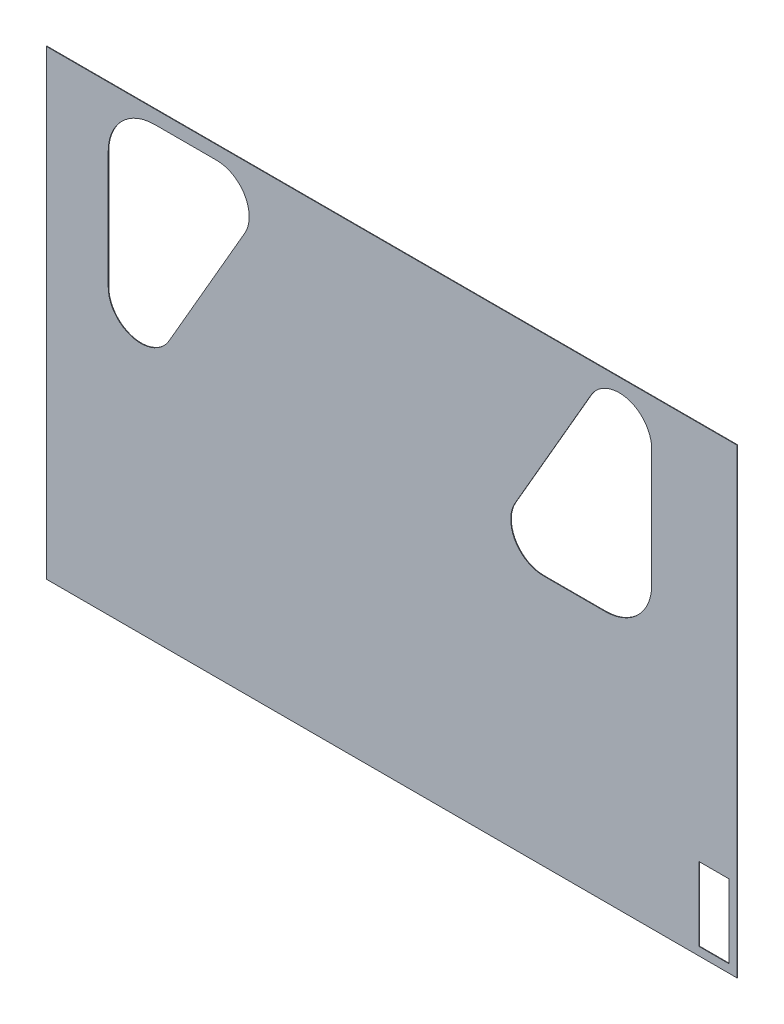
ISO-10303-21;
HEADER;
FILE_DESCRIPTION(('STEP AP214'),'2;1');
FILE_NAME('part.step','',(''),(''),'','','');
FILE_SCHEMA(('AUTOMOTIVE_DESIGN { 1 0 10303 214 1 1 1 1 }'));
ENDSEC;
DATA;
#1=APPLICATION_CONTEXT('core data for automotive mechanical design processes');
#2=APPLICATION_PROTOCOL_DEFINITION('international standard','automotive_design',2000,#1);
#3=PRODUCT_CONTEXT('',#1,'mechanical');
#4=PRODUCT('Part','Part','',(#3));
#5=PRODUCT_RELATED_PRODUCT_CATEGORY('part','',(#4));
#6=PRODUCT_DEFINITION_FORMATION('','',#4);
#7=PRODUCT_DEFINITION_CONTEXT('part definition',#1,'design');
#8=PRODUCT_DEFINITION('design','',#6,#7);
#9=PRODUCT_DEFINITION_SHAPE('','',#8);
#10=(LENGTH_UNIT() NAMED_UNIT(*) SI_UNIT(.MILLI.,.METRE.));
#11=(NAMED_UNIT(*) PLANE_ANGLE_UNIT() SI_UNIT($,.RADIAN.));
#12=(NAMED_UNIT(*) SI_UNIT($,.STERADIAN.) SOLID_ANGLE_UNIT());
#13=UNCERTAINTY_MEASURE_WITH_UNIT(LENGTH_MEASURE(1.E-05),#10,'distance_accuracy_value','');
#14=(GEOMETRIC_REPRESENTATION_CONTEXT(3) GLOBAL_UNCERTAINTY_ASSIGNED_CONTEXT((#13)) GLOBAL_UNIT_ASSIGNED_CONTEXT((#10,
#11,#12)) REPRESENTATION_CONTEXT('',''));
#15=CARTESIAN_POINT('',(0.,0.,0.));
#16=DIRECTION('',(0.,0.,1.));
#17=DIRECTION('',(1.,0.,0.));
#18=AXIS2_PLACEMENT_3D('',#15,#16,#17);
#19=CARTESIAN_POINT('',(0.,0.,2.));
#20=DIRECTION('',(0.,0.,-1.));
#21=DIRECTION('',(-1.,0.,0.));
#22=AXIS2_PLACEMENT_3D('',#19,#20,#21);
#23=PLANE('',#22);
#24=DIRECTION('',(0.,-1.,0.));
#25=VECTOR('',#24,1.);
#26=CARTESIAN_POINT('',(2191.,0.,2.));
#27=LINE('',#26,#25);
#28=CARTESIAN_POINT('',(2191.,1503.,2.));
#29=VERTEX_POINT('',#28);
#30=CARTESIAN_POINT('',(2191.,1078.,2.));
#31=VERTEX_POINT('',#30);
#32=EDGE_CURVE('E265',#29,#31,#27,.T.);
#33=ORIENTED_EDGE('',*,*,#32,.T.);
#34=CARTESIAN_POINT('',(2023.,1078.,2.));
#35=DIRECTION('',(0.,0.,-1.));
#36=DIRECTION('',(-1.,0.,0.));
#37=AXIS2_PLACEMENT_3D('',#34,#35,#36);
#38=CIRCLE('',#37,168.);
#39=CARTESIAN_POINT('',(2023.,909.999999999999,2.));
#40=VERTEX_POINT('',#39);
#41=EDGE_CURVE('E174',#31,#40,#38,.T.);
#42=ORIENTED_EDGE('',*,*,#41,.T.);
#43=DIRECTION('',(-1.,0.,0.));
#44=VECTOR('',#43,1.);
#45=CARTESIAN_POINT('',(-9.01090753129585E-13,909.999999999997,2.));
#46=LINE('',#45,#44);
#47=CARTESIAN_POINT('',(1798.76,909.999999999999,2.));
#48=VERTEX_POINT('',#47);
#49=EDGE_CURVE('E276',#40,#48,#46,.T.);
#50=ORIENTED_EDGE('',*,*,#49,.T.);
#51=CARTESIAN_POINT('',(1798.76,1028.,2.));
#52=DIRECTION('',(0.,0.,-1.));
#53=DIRECTION('',(-1.,0.,0.));
#54=AXIS2_PLACEMENT_3D('',#51,#52,#53);
#55=CIRCLE('',#54,118.);
#56=CARTESIAN_POINT('',(1696.56887399451,1086.99977767526,2.));
#57=VERTEX_POINT('',#56);
#58=EDGE_CURVE('E273',#48,#57,#55,.T.);
#59=ORIENTED_EDGE('',*,*,#58,.T.);
#60=DIRECTION('',(0.499998115891994,0.866026491571971,0.));
#61=VECTOR('',#60,1.);
#62=CARTESIAN_POINT('',(801.746323752941,-462.886130160014,2.));
#63=LINE('',#62,#61);
#64=CARTESIAN_POINT('',(1970.80887399451,1561.99977767525,2.));
#65=VERTEX_POINT('',#64);
#66=EDGE_CURVE('E270',#57,#65,#63,.T.);
#67=ORIENTED_EDGE('',*,*,#66,.T.);
#68=CARTESIAN_POINT('',(2073.,1503.,2.));
#69=DIRECTION('',(0.,0.,-1.));
#70=DIRECTION('',(-1.,0.,0.));
#71=AXIS2_PLACEMENT_3D('',#68,#69,#70);
#72=CIRCLE('',#71,118.);
#73=EDGE_CURVE('E267',#65,#29,#72,.T.);
#74=ORIENTED_EDGE('',*,*,#73,.T.);
#75=EDGE_LOOP('',(#33,#42,#50,#59,#67,#74));
#76=FACE_BOUND('',#75,.T.);
#77=DIRECTION('',(-0.499998115891994,-0.866026491571971,0.));
#78=VECTOR('',#77,1.);
#79=CARTESIAN_POINT('',(-86.4441689240815,49.9083134436634,2.));
#80=LINE('',#79,#78);
#81=CARTESIAN_POINT('',(718.431126005492,1444.00022232474,2.));
#82=VERTEX_POINT('',#81);
#83=CARTESIAN_POINT('',(444.191126005492,969.000222324744,2.));
#84=VERTEX_POINT('',#83);
#85=EDGE_CURVE('E207',#82,#84,#80,.T.);
#86=ORIENTED_EDGE('',*,*,#85,.T.);
#87=CARTESIAN_POINT('',(341.999999999999,1028.,2.));
#88=DIRECTION('',(0.,0.,-1.));
#89=DIRECTION('',(-1.,0.,0.));
#90=AXIS2_PLACEMENT_3D('',#87,#88,#89);
#91=CIRCLE('',#90,118.);
#92=CARTESIAN_POINT('',(223.999999999999,1028.,2.));
#93=VERTEX_POINT('',#92);
#94=EDGE_CURVE('E262',#84,#93,#91,.T.);
#95=ORIENTED_EDGE('',*,*,#94,.T.);
#96=DIRECTION('',(0.,1.,0.));
#97=VECTOR('',#96,1.);
#98=CARTESIAN_POINT('',(223.999999999999,0.,2.));
#99=LINE('',#98,#97);
#100=CARTESIAN_POINT('',(223.999999999999,1453.,2.));
#101=VERTEX_POINT('',#100);
#102=EDGE_CURVE('E259',#93,#101,#99,.T.);
#103=ORIENTED_EDGE('',*,*,#102,.T.);
#104=CARTESIAN_POINT('',(391.999999999999,1453.,2.));
#105=DIRECTION('',(0.,0.,-1.));
#106=DIRECTION('',(-1.,0.,0.));
#107=AXIS2_PLACEMENT_3D('',#104,#105,#106);
#108=CIRCLE('',#107,168.);
#109=CARTESIAN_POINT('',(391.999999999999,1621.,2.));
#110=VERTEX_POINT('',#109);
#111=EDGE_CURVE('E256',#101,#110,#108,.T.);
#112=ORIENTED_EDGE('',*,*,#111,.T.);
#113=DIRECTION('',(1.,0.,0.));
#114=VECTOR('',#113,1.);
#115=CARTESIAN_POINT('',(0.,1621.,2.));
#116=LINE('',#115,#114);
#117=CARTESIAN_POINT('',(616.239999999999,1621.,2.));
#118=VERTEX_POINT('',#117);
#119=EDGE_CURVE('E253',#110,#118,#116,.T.);
#120=ORIENTED_EDGE('',*,*,#119,.T.);
#121=CARTESIAN_POINT('',(616.239999999999,1503.,2.));
#122=DIRECTION('',(0.,0.,-1.));
#123=DIRECTION('',(-1.,0.,0.));
#124=AXIS2_PLACEMENT_3D('',#121,#122,#123);
#125=CIRCLE('',#124,118.);
#126=EDGE_CURVE('E250',#118,#82,#125,.T.);
#127=ORIENTED_EDGE('',*,*,#126,.T.);
#128=EDGE_LOOP('',(#86,#95,#103,#112,#120,#127));
#129=FACE_BOUND('',#128,.T.);
#130=DIRECTION('',(0.,-1.,0.));
#131=VECTOR('',#130,1.);
#132=CARTESIAN_POINT('',(0.,0.,2.));
#133=LINE('',#132,#131);
#134=CARTESIAN_POINT('',(0.,1670.,2.));
#135=VERTEX_POINT('',#134);
#136=CARTESIAN_POINT('',(0.,0.,2.));
#137=VERTEX_POINT('',#136);
#138=EDGE_CURVE('E312',#135,#137,#133,.T.);
#139=ORIENTED_EDGE('',*,*,#138,.T.);
#140=DIRECTION('',(1.,0.,0.));
#141=VECTOR('',#140,1.);
#142=CARTESIAN_POINT('',(0.,0.,2.));
#143=LINE('',#142,#141);
#144=CARTESIAN_POINT('',(2500.,0.,2.));
#145=VERTEX_POINT('',#144);
#146=EDGE_CURVE('E315',#137,#145,#143,.T.);
#147=ORIENTED_EDGE('',*,*,#146,.T.);
#148=DIRECTION('',(0.,1.,0.));
#149=VECTOR('',#148,1.);
#150=CARTESIAN_POINT('',(2500.,0.,2.));
#151=LINE('',#150,#149);
#152=CARTESIAN_POINT('',(2500.,1670.,2.));
#153=VERTEX_POINT('',#152);
#154=EDGE_CURVE('E318',#145,#153,#151,.T.);
#155=ORIENTED_EDGE('',*,*,#154,.T.);
#156=DIRECTION('',(-1.,0.,0.));
#157=VECTOR('',#156,1.);
#158=CARTESIAN_POINT('',(0.,1670.,2.));
#159=LINE('',#158,#157);
#160=EDGE_CURVE('E320',#153,#135,#159,.T.);
#161=ORIENTED_EDGE('',*,*,#160,.T.);
#162=EDGE_LOOP('',(#139,#147,#155,#161));
#163=FACE_BOUND('',#162,.T.);
#164=DIRECTION('',(0.,1.,0.));
#165=VECTOR('',#164,1.);
#166=CARTESIAN_POINT('',(2470.,30.0000000000003,2.));
#167=LINE('',#166,#165);
#168=CARTESIAN_POINT('',(2470.,30.0000000000003,2.));
#169=VERTEX_POINT('',#168);
#170=CARTESIAN_POINT('',(2470.,296.000000000001,2.));
#171=VERTEX_POINT('',#170);
#172=EDGE_CURVE('E281',#169,#171,#167,.T.);
#173=ORIENTED_EDGE('',*,*,#172,.F.);
#174=DIRECTION('',(1.,0.,0.));
#175=VECTOR('',#174,1.);
#176=CARTESIAN_POINT('',(2470.,30.0000000000003,2.));
#177=LINE('',#176,#175);
#178=CARTESIAN_POINT('',(2361.56,30.0000000000004,2.));
#179=VERTEX_POINT('',#178);
#180=EDGE_CURVE('E289',#179,#169,#177,.T.);
#181=ORIENTED_EDGE('',*,*,#180,.F.);
#182=DIRECTION('',(0.,-1.,0.));
#183=VECTOR('',#182,1.);
#184=CARTESIAN_POINT('',(2361.56,30.0000000000004,2.));
#185=LINE('',#184,#183);
#186=CARTESIAN_POINT('',(2361.56,296.,2.));
#187=VERTEX_POINT('',#186);
#188=EDGE_CURVE('E286',#187,#179,#185,.T.);
#189=ORIENTED_EDGE('',*,*,#188,.F.);
#190=DIRECTION('',(-1.,0.,0.));
#191=VECTOR('',#190,1.);
#192=CARTESIAN_POINT('',(2470.,296.000000000001,2.));
#193=LINE('',#192,#191);
#194=EDGE_CURVE('E283',#171,#187,#193,.T.);
#195=ORIENTED_EDGE('',*,*,#194,.F.);
#196=EDGE_LOOP('',(#173,#181,#189,#195));
#197=FACE_BOUND('',#196,.T.);
#198=ADVANCED_FACE('F32',(#76,#129,#163,#197),#23,.F.);
#199=CARTESIAN_POINT('',(0.,0.,0.));
#200=DIRECTION('',(0.,0.,-1.));
#201=DIRECTION('',(-1.,0.,0.));
#202=AXIS2_PLACEMENT_3D('',#199,#200,#201);
#203=PLANE('',#202);
#204=CARTESIAN_POINT('',(2023.,1078.,0.));
#205=DIRECTION('',(0.,0.,1.));
#206=DIRECTION('',(1.,0.,0.));
#207=AXIS2_PLACEMENT_3D('',#204,#205,#206);
#208=CIRCLE('',#207,168.);
#209=CARTESIAN_POINT('',(2023.,909.999999999999,0.));
#210=VERTEX_POINT('',#209);
#211=CARTESIAN_POINT('',(2191.,1078.,0.));
#212=VERTEX_POINT('',#211);
#213=EDGE_CURVE('E171',#210,#212,#208,.T.);
#214=ORIENTED_EDGE('',*,*,#213,.T.);
#215=DIRECTION('',(0.,1.,0.));
#216=VECTOR('',#215,1.);
#217=CARTESIAN_POINT('',(2191.,1078.,0.));
#218=LINE('',#217,#216);
#219=CARTESIAN_POINT('',(2191.,1503.,0.));
#220=VERTEX_POINT('',#219);
#221=EDGE_CURVE('E181',#212,#220,#218,.T.);
#222=ORIENTED_EDGE('',*,*,#221,.T.);
#223=CARTESIAN_POINT('',(2073.,1503.,0.));
#224=DIRECTION('',(0.,0.,1.));
#225=DIRECTION('',(-1.,0.,0.));
#226=AXIS2_PLACEMENT_3D('',#223,#224,#225);
#227=CIRCLE('',#226,118.);
#228=CARTESIAN_POINT('',(1970.80887399451,1561.99977767525,0.));
#229=VERTEX_POINT('',#228);
#230=EDGE_CURVE('E186',#220,#229,#227,.T.);
#231=ORIENTED_EDGE('',*,*,#230,.T.);
#232=DIRECTION('',(-0.499998115891994,-0.86602649157197,0.));
#233=VECTOR('',#232,1.);
#234=CARTESIAN_POINT('',(1970.80887399451,1561.99977767525,0.));
#235=LINE('',#234,#233);
#236=CARTESIAN_POINT('',(1696.56887399451,1086.99977767526,0.));
#237=VERTEX_POINT('',#236);
#238=EDGE_CURVE('E199',#229,#237,#235,.T.);
#239=ORIENTED_EDGE('',*,*,#238,.T.);
#240=CARTESIAN_POINT('',(1798.76,1028.,0.));
#241=DIRECTION('',(0.,0.,1.));
#242=DIRECTION('',(1.,0.,0.));
#243=AXIS2_PLACEMENT_3D('',#240,#241,#242);
#244=CIRCLE('',#243,118.);
#245=CARTESIAN_POINT('',(1798.76,909.999999999999,0.));
#246=VERTEX_POINT('',#245);
#247=EDGE_CURVE('E202',#237,#246,#244,.T.);
#248=ORIENTED_EDGE('',*,*,#247,.T.);
#249=DIRECTION('',(1.,0.,0.));
#250=VECTOR('',#249,1.);
#251=CARTESIAN_POINT('',(1798.76,909.999999999999,0.));
#252=LINE('',#251,#250);
#253=EDGE_CURVE('E177',#246,#210,#252,.T.);
#254=ORIENTED_EDGE('',*,*,#253,.T.);
#255=EDGE_LOOP('',(#214,#222,#231,#239,#248,#254));
#256=FACE_BOUND('',#255,.T.);
#257=CARTESIAN_POINT('',(341.999999999999,1028.,0.));
#258=DIRECTION('',(0.,0.,1.));
#259=DIRECTION('',(1.,0.,0.));
#260=AXIS2_PLACEMENT_3D('',#257,#258,#259);
#261=CIRCLE('',#260,118.);
#262=CARTESIAN_POINT('',(223.999999999999,1028.,0.));
#263=VERTEX_POINT('',#262);
#264=CARTESIAN_POINT('',(444.191126005492,969.000222324744,0.));
#265=VERTEX_POINT('',#264);
#266=EDGE_CURVE('E218',#263,#265,#261,.T.);
#267=ORIENTED_EDGE('',*,*,#266,.T.);
#268=DIRECTION('',(0.499998115891994,0.866026491571971,0.));
#269=VECTOR('',#268,1.);
#270=CARTESIAN_POINT('',(444.191126005492,969.000222324744,0.));
#271=LINE('',#270,#269);
#272=CARTESIAN_POINT('',(718.431126005492,1444.00022232474,0.));
#273=VERTEX_POINT('',#272);
#274=EDGE_CURVE('E221',#265,#273,#271,.T.);
#275=ORIENTED_EDGE('',*,*,#274,.T.);
#276=CARTESIAN_POINT('',(616.239999999999,1503.,0.));
#277=DIRECTION('',(0.,0.,1.));
#278=DIRECTION('',(1.,0.,0.));
#279=AXIS2_PLACEMENT_3D('',#276,#277,#278);
#280=CIRCLE('',#279,118.);
#281=CARTESIAN_POINT('',(616.239999999999,1621.,0.));
#282=VERTEX_POINT('',#281);
#283=EDGE_CURVE('E224',#273,#282,#280,.T.);
#284=ORIENTED_EDGE('',*,*,#283,.T.);
#285=DIRECTION('',(-1.,0.,0.));
#286=VECTOR('',#285,1.);
#287=CARTESIAN_POINT('',(616.239999999999,1621.,0.));
#288=LINE('',#287,#286);
#289=CARTESIAN_POINT('',(391.999999999999,1621.,0.));
#290=VERTEX_POINT('',#289);
#291=EDGE_CURVE('E227',#282,#290,#288,.T.);
#292=ORIENTED_EDGE('',*,*,#291,.T.);
#293=CARTESIAN_POINT('',(391.999999999999,1453.,0.));
#294=DIRECTION('',(0.,0.,1.));
#295=DIRECTION('',(-1.,0.,0.));
#296=AXIS2_PLACEMENT_3D('',#293,#294,#295);
#297=CIRCLE('',#296,168.);
#298=CARTESIAN_POINT('',(223.999999999999,1453.,0.));
#299=VERTEX_POINT('',#298);
#300=EDGE_CURVE('E230',#290,#299,#297,.T.);
#301=ORIENTED_EDGE('',*,*,#300,.T.);
#302=DIRECTION('',(0.,-1.,0.));
#303=VECTOR('',#302,1.);
#304=CARTESIAN_POINT('',(223.999999999999,1453.,0.));
#305=LINE('',#304,#303);
#306=EDGE_CURVE('E233',#299,#263,#305,.T.);
#307=ORIENTED_EDGE('',*,*,#306,.T.);
#308=EDGE_LOOP('',(#267,#275,#284,#292,#301,#307));
#309=FACE_BOUND('',#308,.T.);
#310=DIRECTION('',(0.,-1.,0.));
#311=VECTOR('',#310,1.);
#312=CARTESIAN_POINT('',(0.,0.,0.));
#313=LINE('',#312,#311);
#314=CARTESIAN_POINT('',(0.,1670.,0.));
#315=VERTEX_POINT('',#314);
#316=CARTESIAN_POINT('',(0.,0.,0.));
#317=VERTEX_POINT('',#316);
#318=EDGE_CURVE('E311',#315,#317,#313,.T.);
#319=ORIENTED_EDGE('',*,*,#318,.F.);
#320=DIRECTION('',(-1.,0.,0.));
#321=VECTOR('',#320,1.);
#322=CARTESIAN_POINT('',(0.,1670.,0.));
#323=LINE('',#322,#321);
#324=CARTESIAN_POINT('',(2500.,1670.,0.));
#325=VERTEX_POINT('',#324);
#326=EDGE_CURVE('E316',#325,#315,#323,.T.);
#327=ORIENTED_EDGE('',*,*,#326,.F.);
#328=DIRECTION('',(0.,1.,0.));
#329=VECTOR('',#328,1.);
#330=CARTESIAN_POINT('',(2500.,0.,0.));
#331=LINE('',#330,#329);
#332=CARTESIAN_POINT('',(2500.,0.,0.));
#333=VERTEX_POINT('',#332);
#334=EDGE_CURVE('E327',#333,#325,#331,.T.);
#335=ORIENTED_EDGE('',*,*,#334,.F.);
#336=DIRECTION('',(1.,0.,0.));
#337=VECTOR('',#336,1.);
#338=CARTESIAN_POINT('',(0.,0.,0.));
#339=LINE('',#338,#337);
#340=EDGE_CURVE('E325',#317,#333,#339,.T.);
#341=ORIENTED_EDGE('',*,*,#340,.F.);
#342=EDGE_LOOP('',(#319,#327,#335,#341));
#343=FACE_BOUND('',#342,.T.);
#344=DIRECTION('',(1.,0.,0.));
#345=VECTOR('',#344,1.);
#346=CARTESIAN_POINT('',(2470.,30.0000000000003,0.));
#347=LINE('',#346,#345);
#348=CARTESIAN_POINT('',(2361.56,30.0000000000004,0.));
#349=VERTEX_POINT('',#348);
#350=CARTESIAN_POINT('',(2470.,30.0000000000003,0.));
#351=VERTEX_POINT('',#350);
#352=EDGE_CURVE('E284',#349,#351,#347,.T.);
#353=ORIENTED_EDGE('',*,*,#352,.T.);
#354=DIRECTION('',(0.,1.,0.));
#355=VECTOR('',#354,1.);
#356=CARTESIAN_POINT('',(2470.,30.0000000000003,0.));
#357=LINE('',#356,#355);
#358=CARTESIAN_POINT('',(2470.,296.000000000001,0.));
#359=VERTEX_POINT('',#358);
#360=EDGE_CURVE('E280',#351,#359,#357,.T.);
#361=ORIENTED_EDGE('',*,*,#360,.T.);
#362=DIRECTION('',(-1.,0.,0.));
#363=VECTOR('',#362,1.);
#364=CARTESIAN_POINT('',(2470.,296.000000000001,0.));
#365=LINE('',#364,#363);
#366=CARTESIAN_POINT('',(2361.56,296.,0.));
#367=VERTEX_POINT('',#366);
#368=EDGE_CURVE('E294',#359,#367,#365,.T.);
#369=ORIENTED_EDGE('',*,*,#368,.T.);
#370=DIRECTION('',(0.,-1.,0.));
#371=VECTOR('',#370,1.);
#372=CARTESIAN_POINT('',(2361.56,30.0000000000004,0.));
#373=LINE('',#372,#371);
#374=EDGE_CURVE('E297',#367,#349,#373,.T.);
#375=ORIENTED_EDGE('',*,*,#374,.T.);
#376=EDGE_LOOP('',(#353,#361,#369,#375));
#377=FACE_BOUND('',#376,.T.);
#378=ADVANCED_FACE('F188',(#256,#309,#343,#377),#203,.T.);
#379=CARTESIAN_POINT('',(0.,0.,2.));
#380=DIRECTION('',(1.,0.,0.));
#381=DIRECTION('',(0.,0.,-1.));
#382=AXIS2_PLACEMENT_3D('',#379,#380,#381);
#383=PLANE('',#382);
#384=ORIENTED_EDGE('',*,*,#318,.T.);
#385=DIRECTION('',(0.,0.,-1.));
#386=VECTOR('',#385,1.);
#387=CARTESIAN_POINT('',(0.,0.,2.));
#388=LINE('',#387,#386);
#389=EDGE_CURVE('E11',#137,#317,#388,.T.);
#390=ORIENTED_EDGE('',*,*,#389,.F.);
#391=ORIENTED_EDGE('',*,*,#138,.F.);
#392=DIRECTION('',(0.,0.,-1.));
#393=VECTOR('',#392,1.);
#394=CARTESIAN_POINT('',(0.,1670.,2.));
#395=LINE('',#394,#393);
#396=EDGE_CURVE('E322',#135,#315,#395,.T.);
#397=ORIENTED_EDGE('',*,*,#396,.T.);
#398=EDGE_LOOP('',(#384,#390,#391,#397));
#399=FACE_BOUND('',#398,.T.);
#400=ADVANCED_FACE('F34',(#399),#383,.F.);
#401=CARTESIAN_POINT('',(0.,0.,2.));
#402=DIRECTION('',(0.,1.,0.));
#403=DIRECTION('',(0.,0.,1.));
#404=AXIS2_PLACEMENT_3D('',#401,#402,#403);
#405=PLANE('',#404);
#406=ORIENTED_EDGE('',*,*,#340,.T.);
#407=DIRECTION('',(0.,0.,-1.));
#408=VECTOR('',#407,1.);
#409=CARTESIAN_POINT('',(2500.,0.,2.));
#410=LINE('',#409,#408);
#411=EDGE_CURVE('E40',#145,#333,#410,.T.);
#412=ORIENTED_EDGE('',*,*,#411,.F.);
#413=ORIENTED_EDGE('',*,*,#146,.F.);
#414=ORIENTED_EDGE('',*,*,#389,.T.);
#415=EDGE_LOOP('',(#406,#412,#413,#414));
#416=FACE_BOUND('',#415,.T.);
#417=ADVANCED_FACE('F355',(#416),#405,.F.);
#418=CARTESIAN_POINT('',(2500.,0.,2.));
#419=DIRECTION('',(-1.,0.,0.));
#420=DIRECTION('',(0.,0.,1.));
#421=AXIS2_PLACEMENT_3D('',#418,#419,#420);
#422=PLANE('',#421);
#423=ORIENTED_EDGE('',*,*,#334,.T.);
#424=DIRECTION('',(0.,0.,-1.));
#425=VECTOR('',#424,1.);
#426=CARTESIAN_POINT('',(2500.,1670.,2.));
#427=LINE('',#426,#425);
#428=EDGE_CURVE('E332',#153,#325,#427,.T.);
#429=ORIENTED_EDGE('',*,*,#428,.F.);
#430=ORIENTED_EDGE('',*,*,#154,.F.);
#431=ORIENTED_EDGE('',*,*,#411,.T.);
#432=EDGE_LOOP('',(#423,#429,#430,#431));
#433=FACE_BOUND('',#432,.T.);
#434=ADVANCED_FACE('F339',(#433),#422,.F.);
#435=CARTESIAN_POINT('',(0.,1670.,2.));
#436=DIRECTION('',(0.,-1.,0.));
#437=DIRECTION('',(0.,0.,-1.));
#438=AXIS2_PLACEMENT_3D('',#435,#436,#437);
#439=PLANE('',#438);
#440=ORIENTED_EDGE('',*,*,#326,.T.);
#441=ORIENTED_EDGE('',*,*,#396,.F.);
#442=ORIENTED_EDGE('',*,*,#160,.F.);
#443=ORIENTED_EDGE('',*,*,#428,.T.);
#444=EDGE_LOOP('',(#440,#441,#442,#443));
#445=FACE_BOUND('',#444,.T.);
#446=ADVANCED_FACE('F348',(#445),#439,.F.);
#447=CARTESIAN_POINT('',(2470.,30.0000000000003,2.));
#448=DIRECTION('',(-1.,0.,0.));
#449=DIRECTION('',(0.,0.,1.));
#450=AXIS2_PLACEMENT_3D('',#447,#448,#449);
#451=PLANE('',#450);
#452=ORIENTED_EDGE('',*,*,#360,.F.);
#453=DIRECTION('',(0.,0.,-1.));
#454=VECTOR('',#453,1.);
#455=CARTESIAN_POINT('',(2470.,30.0000000000003,2.));
#456=LINE('',#455,#454);
#457=EDGE_CURVE('E291',#169,#351,#456,.T.);
#458=ORIENTED_EDGE('',*,*,#457,.F.);
#459=ORIENTED_EDGE('',*,*,#172,.T.);
#460=DIRECTION('',(0.,0.,-1.));
#461=VECTOR('',#460,1.);
#462=CARTESIAN_POINT('',(2470.,296.000000000001,2.));
#463=LINE('',#462,#461);
#464=EDGE_CURVE('E308',#171,#359,#463,.T.);
#465=ORIENTED_EDGE('',*,*,#464,.T.);
#466=EDGE_LOOP('',(#452,#458,#459,#465));
#467=FACE_BOUND('',#466,.T.);
#468=ADVANCED_FACE('F372',(#467),#451,.T.);
#469=CARTESIAN_POINT('',(2470.,296.000000000001,2.));
#470=DIRECTION('',(0.,-1.,0.));
#471=DIRECTION('',(1.,0.,0.));
#472=AXIS2_PLACEMENT_3D('',#469,#470,#471);
#473=PLANE('',#472);
#474=ORIENTED_EDGE('',*,*,#368,.F.);
#475=ORIENTED_EDGE('',*,*,#464,.F.);
#476=ORIENTED_EDGE('',*,*,#194,.T.);
#477=DIRECTION('',(0.,0.,-1.));
#478=VECTOR('',#477,1.);
#479=CARTESIAN_POINT('',(2361.56,296.,2.));
#480=LINE('',#479,#478);
#481=EDGE_CURVE('E306',#187,#367,#480,.T.);
#482=ORIENTED_EDGE('',*,*,#481,.T.);
#483=EDGE_LOOP('',(#474,#475,#476,#482));
#484=FACE_BOUND('',#483,.T.);
#485=ADVANCED_FACE('F379',(#484),#473,.T.);
#486=CARTESIAN_POINT('',(2361.56,30.0000000000004,2.));
#487=DIRECTION('',(1.,0.,0.));
#488=DIRECTION('',(0.,1.,0.));
#489=AXIS2_PLACEMENT_3D('',#486,#487,#488);
#490=PLANE('',#489);
#491=ORIENTED_EDGE('',*,*,#374,.F.);
#492=ORIENTED_EDGE('',*,*,#481,.F.);
#493=ORIENTED_EDGE('',*,*,#188,.T.);
#494=DIRECTION('',(0.,0.,-1.));
#495=VECTOR('',#494,1.);
#496=CARTESIAN_POINT('',(2361.56,30.0000000000004,2.));
#497=LINE('',#496,#495);
#498=EDGE_CURVE('E304',#179,#349,#497,.T.);
#499=ORIENTED_EDGE('',*,*,#498,.T.);
#500=EDGE_LOOP('',(#491,#492,#493,#499));
#501=FACE_BOUND('',#500,.T.);
#502=ADVANCED_FACE('F384',(#501),#490,.T.);
#503=CARTESIAN_POINT('',(2470.,30.0000000000003,2.));
#504=DIRECTION('',(0.,1.,0.));
#505=DIRECTION('',(-1.,0.,0.));
#506=AXIS2_PLACEMENT_3D('',#503,#504,#505);
#507=PLANE('',#506);
#508=ORIENTED_EDGE('',*,*,#352,.F.);
#509=ORIENTED_EDGE('',*,*,#498,.F.);
#510=ORIENTED_EDGE('',*,*,#180,.T.);
#511=ORIENTED_EDGE('',*,*,#457,.T.);
#512=EDGE_LOOP('',(#508,#509,#510,#511));
#513=FACE_BOUND('',#512,.T.);
#514=ADVANCED_FACE('F391',(#513),#507,.T.);
#515=CARTESIAN_POINT('',(341.999999999999,1028.,0.));
#516=DIRECTION('',(0.,0.,1.));
#517=DIRECTION('',(1.,0.,0.));
#518=AXIS2_PLACEMENT_3D('',#515,#516,#517);
#519=CYLINDRICAL_SURFACE('',#518,118.);
#520=DIRECTION('',(0.,0.,1.));
#521=VECTOR('',#520,1.);
#522=CARTESIAN_POINT('',(444.191126005492,969.000222324744,0.));
#523=LINE('',#522,#521);
#524=EDGE_CURVE('E55',#265,#84,#523,.T.);
#525=ORIENTED_EDGE('',*,*,#524,.F.);
#526=ORIENTED_EDGE('',*,*,#266,.F.);
#527=DIRECTION('',(0.,0.,1.));
#528=VECTOR('',#527,1.);
#529=CARTESIAN_POINT('',(223.999999999999,1028.,0.));
#530=LINE('',#529,#528);
#531=EDGE_CURVE('E192',#263,#93,#530,.T.);
#532=ORIENTED_EDGE('',*,*,#531,.T.);
#533=ORIENTED_EDGE('',*,*,#94,.F.);
#534=EDGE_LOOP('',(#525,#526,#532,#533));
#535=FACE_BOUND('',#534,.T.);
#536=ADVANCED_FACE('F403',(#535),#519,.F.);
#537=CARTESIAN_POINT('',(223.999999999999,1453.,0.));
#538=DIRECTION('',(-1.,0.,0.));
#539=DIRECTION('',(0.,-1.,0.));
#540=AXIS2_PLACEMENT_3D('',#537,#538,#539);
#541=PLANE('',#540);
#542=ORIENTED_EDGE('',*,*,#531,.F.);
#543=ORIENTED_EDGE('',*,*,#306,.F.);
#544=DIRECTION('',(0.,0.,1.));
#545=VECTOR('',#544,1.);
#546=CARTESIAN_POINT('',(223.999999999999,1453.,0.));
#547=LINE('',#546,#545);
#548=EDGE_CURVE('E195',#299,#101,#547,.T.);
#549=ORIENTED_EDGE('',*,*,#548,.T.);
#550=ORIENTED_EDGE('',*,*,#102,.F.);
#551=EDGE_LOOP('',(#542,#543,#549,#550));
#552=FACE_BOUND('',#551,.T.);
#553=ADVANCED_FACE('F408',(#552),#541,.F.);
#554=CARTESIAN_POINT('',(391.999999999999,1453.,0.));
#555=DIRECTION('',(0.,0.,1.));
#556=DIRECTION('',(1.,0.,0.));
#557=AXIS2_PLACEMENT_3D('',#554,#555,#556);
#558=CYLINDRICAL_SURFACE('',#557,168.);
#559=ORIENTED_EDGE('',*,*,#548,.F.);
#560=ORIENTED_EDGE('',*,*,#300,.F.);
#561=DIRECTION('',(0.,0.,1.));
#562=VECTOR('',#561,1.);
#563=CARTESIAN_POINT('',(391.999999999999,1621.,0.));
#564=LINE('',#563,#562);
#565=EDGE_CURVE('E238',#290,#110,#564,.T.);
#566=ORIENTED_EDGE('',*,*,#565,.T.);
#567=ORIENTED_EDGE('',*,*,#111,.F.);
#568=EDGE_LOOP('',(#559,#560,#566,#567));
#569=FACE_BOUND('',#568,.T.);
#570=ADVANCED_FACE('F420',(#569),#558,.F.);
#571=CARTESIAN_POINT('',(616.239999999999,1621.,0.));
#572=DIRECTION('',(0.,1.,0.));
#573=DIRECTION('',(0.,0.,1.));
#574=AXIS2_PLACEMENT_3D('',#571,#572,#573);
#575=PLANE('',#574);
#576=ORIENTED_EDGE('',*,*,#565,.F.);
#577=ORIENTED_EDGE('',*,*,#291,.F.);
#578=DIRECTION('',(0.,0.,1.));
#579=VECTOR('',#578,1.);
#580=CARTESIAN_POINT('',(616.239999999999,1621.,0.));
#581=LINE('',#580,#579);
#582=EDGE_CURVE('E241',#282,#118,#581,.T.);
#583=ORIENTED_EDGE('',*,*,#582,.T.);
#584=ORIENTED_EDGE('',*,*,#119,.F.);
#585=EDGE_LOOP('',(#576,#577,#583,#584));
#586=FACE_BOUND('',#585,.T.);
#587=ADVANCED_FACE('F416',(#586),#575,.F.);
#588=CARTESIAN_POINT('',(616.239999999999,1503.,0.));
#589=DIRECTION('',(0.,0.,1.));
#590=DIRECTION('',(1.,0.,0.));
#591=AXIS2_PLACEMENT_3D('',#588,#589,#590);
#592=CYLINDRICAL_SURFACE('',#591,118.);
#593=ORIENTED_EDGE('',*,*,#582,.F.);
#594=ORIENTED_EDGE('',*,*,#283,.F.);
#595=DIRECTION('',(0.,0.,1.));
#596=VECTOR('',#595,1.);
#597=CARTESIAN_POINT('',(718.431126005492,1444.00022232474,0.));
#598=LINE('',#597,#596);
#599=EDGE_CURVE('E244',#273,#82,#598,.T.);
#600=ORIENTED_EDGE('',*,*,#599,.T.);
#601=ORIENTED_EDGE('',*,*,#126,.F.);
#602=EDGE_LOOP('',(#593,#594,#600,#601));
#603=FACE_BOUND('',#602,.T.);
#604=ADVANCED_FACE('F413',(#603),#592,.F.);
#605=CARTESIAN_POINT('',(444.191126005492,969.000222324744,0.));
#606=DIRECTION('',(0.866026491571971,-0.499998115891994,0.));
#607=DIRECTION('',(0.499998115891994,0.866026491571971,0.));
#608=AXIS2_PLACEMENT_3D('',#605,#606,#607);
#609=PLANE('',#608);
#610=ORIENTED_EDGE('',*,*,#599,.F.);
#611=ORIENTED_EDGE('',*,*,#274,.F.);
#612=ORIENTED_EDGE('',*,*,#524,.T.);
#613=ORIENTED_EDGE('',*,*,#85,.F.);
#614=EDGE_LOOP('',(#610,#611,#612,#613));
#615=FACE_BOUND('',#614,.T.);
#616=ADVANCED_FACE('F410',(#615),#609,.F.);
#617=CARTESIAN_POINT('',(2023.,1078.,0.));
#618=DIRECTION('',(0.,0.,1.));
#619=DIRECTION('',(1.,0.,0.));
#620=AXIS2_PLACEMENT_3D('',#617,#618,#619);
#621=CYLINDRICAL_SURFACE('',#620,168.);
#622=DIRECTION('',(0.,0.,1.));
#623=VECTOR('',#622,1.);
#624=CARTESIAN_POINT('',(2191.,1078.,0.));
#625=LINE('',#624,#623);
#626=EDGE_CURVE('E47',#212,#31,#625,.T.);
#627=ORIENTED_EDGE('',*,*,#626,.F.);
#628=ORIENTED_EDGE('',*,*,#213,.F.);
#629=DIRECTION('',(0.,0.,1.));
#630=VECTOR('',#629,1.);
#631=CARTESIAN_POINT('',(2023.,909.999999999999,0.));
#632=LINE('',#631,#630);
#633=EDGE_CURVE('E205',#210,#40,#632,.T.);
#634=ORIENTED_EDGE('',*,*,#633,.T.);
#635=ORIENTED_EDGE('',*,*,#41,.F.);
#636=EDGE_LOOP('',(#627,#628,#634,#635));
#637=FACE_BOUND('',#636,.T.);
#638=ADVANCED_FACE('F168',(#637),#621,.F.);
#639=CARTESIAN_POINT('',(1798.76,909.999999999999,0.));
#640=DIRECTION('',(0.,-1.,0.));
#641=DIRECTION('',(1.,0.,0.));
#642=AXIS2_PLACEMENT_3D('',#639,#640,#641);
#643=PLANE('',#642);
#644=ORIENTED_EDGE('',*,*,#633,.F.);
#645=ORIENTED_EDGE('',*,*,#253,.F.);
#646=DIRECTION('',(0.,0.,1.));
#647=VECTOR('',#646,1.);
#648=CARTESIAN_POINT('',(1798.76,909.999999999999,0.));
#649=LINE('',#648,#647);
#650=EDGE_CURVE('E208',#246,#48,#649,.T.);
#651=ORIENTED_EDGE('',*,*,#650,.T.);
#652=ORIENTED_EDGE('',*,*,#49,.F.);
#653=EDGE_LOOP('',(#644,#645,#651,#652));
#654=FACE_BOUND('',#653,.T.);
#655=ADVANCED_FACE('F430',(#654),#643,.F.);
#656=CARTESIAN_POINT('',(1798.76,1028.,0.));
#657=DIRECTION('',(0.,0.,1.));
#658=DIRECTION('',(1.,0.,0.));
#659=AXIS2_PLACEMENT_3D('',#656,#657,#658);
#660=CYLINDRICAL_SURFACE('',#659,118.);
#661=ORIENTED_EDGE('',*,*,#650,.F.);
#662=ORIENTED_EDGE('',*,*,#247,.F.);
#663=DIRECTION('',(0.,0.,1.));
#664=VECTOR('',#663,1.);
#665=CARTESIAN_POINT('',(1696.56887399451,1086.99977767526,0.));
#666=LINE('',#665,#664);
#667=EDGE_CURVE('E211',#237,#57,#666,.T.);
#668=ORIENTED_EDGE('',*,*,#667,.T.);
#669=ORIENTED_EDGE('',*,*,#58,.F.);
#670=EDGE_LOOP('',(#661,#662,#668,#669));
#671=FACE_BOUND('',#670,.T.);
#672=ADVANCED_FACE('F440',(#671),#660,.F.);
#673=CARTESIAN_POINT('',(1970.80887399451,1561.99977767525,0.));
#674=DIRECTION('',(-0.86602649157197,0.499998115891994,0.));
#675=DIRECTION('',(-0.499998115891994,-0.866026491571971,0.));
#676=AXIS2_PLACEMENT_3D('',#673,#674,#675);
#677=PLANE('',#676);
#678=ORIENTED_EDGE('',*,*,#667,.F.);
#679=ORIENTED_EDGE('',*,*,#238,.F.);
#680=DIRECTION('',(0.,0.,1.));
#681=VECTOR('',#680,1.);
#682=CARTESIAN_POINT('',(1970.80887399451,1561.99977767525,0.));
#683=LINE('',#682,#681);
#684=EDGE_CURVE('E214',#229,#65,#683,.T.);
#685=ORIENTED_EDGE('',*,*,#684,.T.);
#686=ORIENTED_EDGE('',*,*,#66,.F.);
#687=EDGE_LOOP('',(#678,#679,#685,#686));
#688=FACE_BOUND('',#687,.T.);
#689=ADVANCED_FACE('F436',(#688),#677,.F.);
#690=CARTESIAN_POINT('',(2073.,1503.,0.));
#691=DIRECTION('',(0.,0.,1.));
#692=DIRECTION('',(1.,0.,0.));
#693=AXIS2_PLACEMENT_3D('',#690,#691,#692);
#694=CYLINDRICAL_SURFACE('',#693,118.);
#695=ORIENTED_EDGE('',*,*,#684,.F.);
#696=ORIENTED_EDGE('',*,*,#230,.F.);
#697=DIRECTION('',(0.,0.,1.));
#698=VECTOR('',#697,1.);
#699=CARTESIAN_POINT('',(2191.,1503.,0.));
#700=LINE('',#699,#698);
#701=EDGE_CURVE('E176',#220,#29,#700,.T.);
#702=ORIENTED_EDGE('',*,*,#701,.T.);
#703=ORIENTED_EDGE('',*,*,#73,.F.);
#704=EDGE_LOOP('',(#695,#696,#702,#703));
#705=FACE_BOUND('',#704,.T.);
#706=ADVANCED_FACE('F433',(#705),#694,.F.);
#707=CARTESIAN_POINT('',(2191.,1078.,0.));
#708=DIRECTION('',(1.,0.,0.));
#709=DIRECTION('',(0.,0.,-1.));
#710=AXIS2_PLACEMENT_3D('',#707,#708,#709);
#711=PLANE('',#710);
#712=ORIENTED_EDGE('',*,*,#701,.F.);
#713=ORIENTED_EDGE('',*,*,#221,.F.);
#714=ORIENTED_EDGE('',*,*,#626,.T.);
#715=ORIENTED_EDGE('',*,*,#32,.F.);
#716=EDGE_LOOP('',(#712,#713,#714,#715));
#717=FACE_BOUND('',#716,.T.);
#718=ADVANCED_FACE('F182',(#717),#711,.F.);
#719=CLOSED_SHELL('',(#198,#378,#400,#417,#434,#446,#468,#485,#502,#514,#536,#553,#570,#587,
#604,#616,#638,#655,#672,#689,#706,#718));
#720=MANIFOLD_SOLID_BREP('B2',#719);
#721=ADVANCED_BREP_SHAPE_REPRESENTATION('',(#18,#720),#14);
#722=SHAPE_DEFINITION_REPRESENTATION(#9,#721);
ENDSEC;
END-ISO-10303-21;
